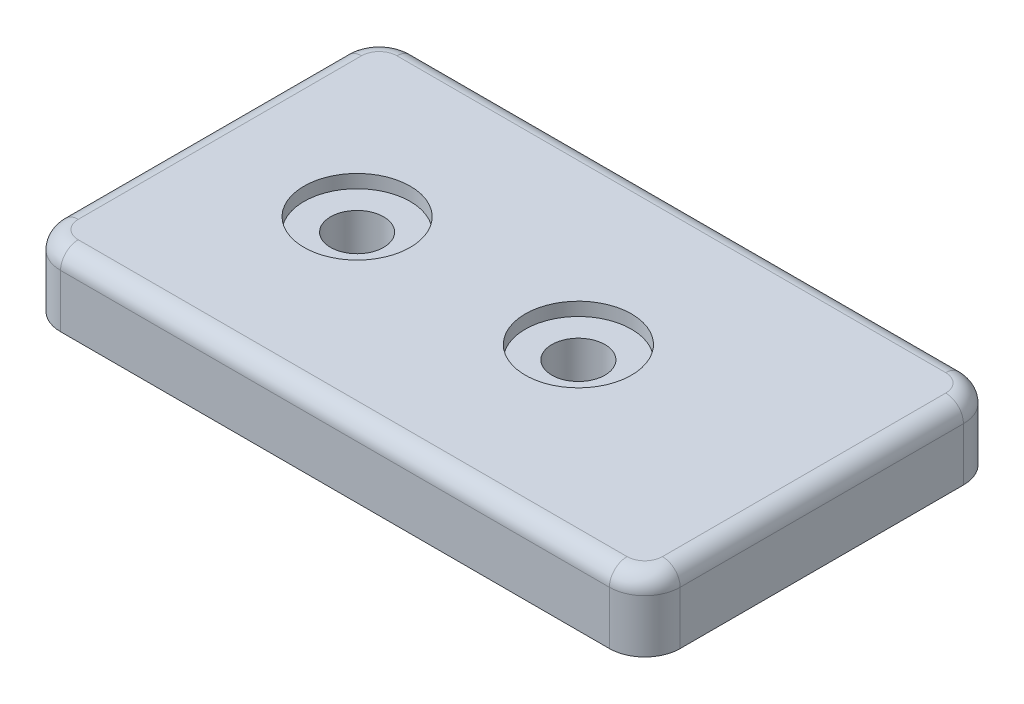
ISO-10303-21;
HEADER;
FILE_DESCRIPTION(('STEP AP214'),'2;1');
FILE_NAME('part.step','',(''),(''),'','','');
FILE_SCHEMA(('AUTOMOTIVE_DESIGN { 1 0 10303 214 1 1 1 1 }'));
ENDSEC;
DATA;
#1=APPLICATION_CONTEXT('core data for automotive mechanical design processes');
#2=APPLICATION_PROTOCOL_DEFINITION('international standard','automotive_design',2000,#1);
#3=PRODUCT_CONTEXT('',#1,'mechanical');
#4=PRODUCT('Part','Part','',(#3));
#5=PRODUCT_RELATED_PRODUCT_CATEGORY('part','',(#4));
#6=PRODUCT_DEFINITION_FORMATION('','',#4);
#7=PRODUCT_DEFINITION_CONTEXT('part definition',#1,'design');
#8=PRODUCT_DEFINITION('design','',#6,#7);
#9=PRODUCT_DEFINITION_SHAPE('','',#8);
#10=(LENGTH_UNIT() NAMED_UNIT(*) SI_UNIT(.MILLI.,.METRE.));
#11=(NAMED_UNIT(*) PLANE_ANGLE_UNIT() SI_UNIT($,.RADIAN.));
#12=(NAMED_UNIT(*) SI_UNIT($,.STERADIAN.) SOLID_ANGLE_UNIT());
#13=UNCERTAINTY_MEASURE_WITH_UNIT(LENGTH_MEASURE(1.E-05),#10,'distance_accuracy_value','');
#14=(GEOMETRIC_REPRESENTATION_CONTEXT(3) GLOBAL_UNCERTAINTY_ASSIGNED_CONTEXT((#13)) GLOBAL_UNIT_ASSIGNED_CONTEXT((#10,
#11,#12)) REPRESENTATION_CONTEXT('',''));
#15=CARTESIAN_POINT('',(0.,0.,0.));
#16=DIRECTION('',(0.,0.,1.));
#17=DIRECTION('',(1.,0.,0.));
#18=AXIS2_PLACEMENT_3D('',#15,#16,#17);
#19=CARTESIAN_POINT('',(12.5,8.,0.));
#20=DIRECTION('',(0.,-1.,0.));
#21=DIRECTION('',(0.,0.,1.));
#22=AXIS2_PLACEMENT_3D('',#19,#20,#21);
#23=CYLINDRICAL_SURFACE('',#22,3.);
#24=CARTESIAN_POINT('',(12.5,0.,0.));
#25=DIRECTION('',(0.,-1.,0.));
#26=DIRECTION('',(0.,0.,-1.));
#27=AXIS2_PLACEMENT_3D('',#24,#25,#26);
#28=CIRCLE('',#27,3.);
#29=CARTESIAN_POINT('',(12.5,0.,-2.99999999999999));
#30=VERTEX_POINT('',#29);
#31=EDGE_CURVE('E295',#30,#30,#28,.T.);
#32=ORIENTED_EDGE('',*,*,#31,.T.);
#33=EDGE_LOOP('',(#32));
#34=FACE_BOUND('',#33,.T.);
#35=CARTESIAN_POINT('',(12.5,6.5,0.));
#36=DIRECTION('',(0.,-1.,0.));
#37=DIRECTION('',(0.,0.,-1.));
#38=AXIS2_PLACEMENT_3D('',#35,#36,#37);
#39=CIRCLE('',#38,3.);
#40=CARTESIAN_POINT('',(12.5,6.5,-2.99999999999999));
#41=VERTEX_POINT('',#40);
#42=EDGE_CURVE('E280',#41,#41,#39,.T.);
#43=ORIENTED_EDGE('',*,*,#42,.F.);
#44=EDGE_LOOP('',(#43));
#45=FACE_BOUND('',#44,.T.);
#46=ADVANCED_FACE('F43',(#34,#45),#23,.F.);
#47=CARTESIAN_POINT('',(-12.5,8.,0.));
#48=DIRECTION('',(0.,-1.,0.));
#49=DIRECTION('',(0.,0.,1.));
#50=AXIS2_PLACEMENT_3D('',#47,#48,#49);
#51=CYLINDRICAL_SURFACE('',#50,3.);
#52=CARTESIAN_POINT('',(-12.5,0.,0.));
#53=DIRECTION('',(0.,-1.,0.));
#54=DIRECTION('',(0.,0.,-1.));
#55=AXIS2_PLACEMENT_3D('',#52,#53,#54);
#56=CIRCLE('',#55,3.);
#57=CARTESIAN_POINT('',(-12.5,0.,-3.));
#58=VERTEX_POINT('',#57);
#59=EDGE_CURVE('E298',#58,#58,#56,.T.);
#60=ORIENTED_EDGE('',*,*,#59,.T.);
#61=EDGE_LOOP('',(#60));
#62=FACE_BOUND('',#61,.T.);
#63=CARTESIAN_POINT('',(-12.5,6.5,0.));
#64=DIRECTION('',(0.,-1.,0.));
#65=DIRECTION('',(0.,0.,-1.));
#66=AXIS2_PLACEMENT_3D('',#63,#64,#65);
#67=CIRCLE('',#66,3.);
#68=CARTESIAN_POINT('',(-12.5,6.5,-3.));
#69=VERTEX_POINT('',#68);
#70=EDGE_CURVE('E265',#69,#69,#67,.T.);
#71=ORIENTED_EDGE('',*,*,#70,.F.);
#72=EDGE_LOOP('',(#71));
#73=FACE_BOUND('',#72,.T.);
#74=ADVANCED_FACE('F499',(#62,#73),#51,.F.);
#75=CARTESIAN_POINT('',(36.,8.,16.));
#76=DIRECTION('',(0.,-1.,0.));
#77=DIRECTION('',(0.,0.,1.));
#78=AXIS2_PLACEMENT_3D('',#75,#76,#77);
#79=CYLINDRICAL_SURFACE('',#78,4.);
#80=DIRECTION('',(0.,-1.,0.));
#81=VECTOR('',#80,1.);
#82=CARTESIAN_POINT('',(36.,8.,20.));
#83=LINE('',#82,#81);
#84=CARTESIAN_POINT('',(36.,6.,20.));
#85=VERTEX_POINT('',#84);
#86=CARTESIAN_POINT('',(36.,0.,20.));
#87=VERTEX_POINT('',#86);
#88=EDGE_CURVE('E322',#85,#87,#83,.T.);
#89=ORIENTED_EDGE('',*,*,#88,.T.);
#90=CARTESIAN_POINT('',(36.,0.,16.));
#91=DIRECTION('',(0.,-1.,0.));
#92=DIRECTION('',(0.,0.,-1.));
#93=AXIS2_PLACEMENT_3D('',#90,#91,#92);
#94=CIRCLE('',#93,4.);
#95=CARTESIAN_POINT('',(40.,0.,16.));
#96=VERTEX_POINT('',#95);
#97=EDGE_CURVE('E276',#87,#96,#94,.F.);
#98=ORIENTED_EDGE('',*,*,#97,.T.);
#99=DIRECTION('',(0.,-1.,0.));
#100=VECTOR('',#99,1.);
#101=CARTESIAN_POINT('',(40.,8.,16.));
#102=LINE('',#101,#100);
#103=CARTESIAN_POINT('',(40.,6.,16.));
#104=VERTEX_POINT('',#103);
#105=EDGE_CURVE('E301',#104,#96,#102,.T.);
#106=ORIENTED_EDGE('',*,*,#105,.F.);
#107=CARTESIAN_POINT('',(36.,6.,16.));
#108=DIRECTION('',(0.,-1.,0.));
#109=DIRECTION('',(0.,0.,-1.));
#110=AXIS2_PLACEMENT_3D('',#107,#108,#109);
#111=CIRCLE('',#110,4.);
#112=EDGE_CURVE('E371',#85,#104,#111,.F.);
#113=ORIENTED_EDGE('',*,*,#112,.F.);
#114=EDGE_LOOP('',(#89,#98,#106,#113));
#115=FACE_BOUND('',#114,.T.);
#116=ADVANCED_FACE('F505',(#115),#79,.T.);
#117=CARTESIAN_POINT('',(0.,8.,20.));
#118=DIRECTION('',(0.,0.,1.));
#119=DIRECTION('',(-1.,0.,0.));
#120=AXIS2_PLACEMENT_3D('',#117,#118,#119);
#121=PLANE('',#120);
#122=DIRECTION('',(0.,-1.,0.));
#123=VECTOR('',#122,1.);
#124=CARTESIAN_POINT('',(-26.,8.,20.));
#125=LINE('',#124,#123);
#126=CARTESIAN_POINT('',(-26.,6.,20.));
#127=VERTEX_POINT('',#126);
#128=CARTESIAN_POINT('',(-26.,0.,20.));
#129=VERTEX_POINT('',#128);
#130=EDGE_CURVE('E319',#127,#129,#125,.T.);
#131=ORIENTED_EDGE('',*,*,#130,.T.);
#132=DIRECTION('',(1.,0.,0.));
#133=VECTOR('',#132,1.);
#134=CARTESIAN_POINT('',(0.,0.,20.));
#135=LINE('',#134,#133);
#136=EDGE_CURVE('E279',#129,#87,#135,.T.);
#137=ORIENTED_EDGE('',*,*,#136,.T.);
#138=ORIENTED_EDGE('',*,*,#88,.F.);
#139=DIRECTION('',(1.,0.,0.));
#140=VECTOR('',#139,1.);
#141=CARTESIAN_POINT('',(0.,6.,20.));
#142=LINE('',#141,#140);
#143=EDGE_CURVE('E374',#127,#85,#142,.T.);
#144=ORIENTED_EDGE('',*,*,#143,.F.);
#145=EDGE_LOOP('',(#131,#137,#138,#144));
#146=FACE_BOUND('',#145,.T.);
#147=ADVANCED_FACE('F535',(#146),#121,.T.);
#148=CARTESIAN_POINT('',(-26.,8.,16.));
#149=DIRECTION('',(0.,-1.,0.));
#150=DIRECTION('',(0.,0.,1.));
#151=AXIS2_PLACEMENT_3D('',#148,#149,#150);
#152=CYLINDRICAL_SURFACE('',#151,4.);
#153=DIRECTION('',(0.,-1.,0.));
#154=VECTOR('',#153,1.);
#155=CARTESIAN_POINT('',(-30.,8.,16.));
#156=LINE('',#155,#154);
#157=CARTESIAN_POINT('',(-30.,6.,16.));
#158=VERTEX_POINT('',#157);
#159=CARTESIAN_POINT('',(-30.,0.,16.));
#160=VERTEX_POINT('',#159);
#161=EDGE_CURVE('E316',#158,#160,#156,.T.);
#162=ORIENTED_EDGE('',*,*,#161,.T.);
#163=CARTESIAN_POINT('',(-26.,0.,16.));
#164=DIRECTION('',(0.,-1.,0.));
#165=DIRECTION('',(0.,0.,-1.));
#166=AXIS2_PLACEMENT_3D('',#163,#164,#165);
#167=CIRCLE('',#166,4.);
#168=EDGE_CURVE('E282',#160,#129,#167,.F.);
#169=ORIENTED_EDGE('',*,*,#168,.T.);
#170=ORIENTED_EDGE('',*,*,#130,.F.);
#171=CARTESIAN_POINT('',(-26.,6.,16.));
#172=DIRECTION('',(0.,-1.,0.));
#173=DIRECTION('',(0.,0.,-1.));
#174=AXIS2_PLACEMENT_3D('',#171,#172,#173);
#175=CIRCLE('',#174,4.);
#176=EDGE_CURVE('E325',#158,#127,#175,.F.);
#177=ORIENTED_EDGE('',*,*,#176,.F.);
#178=EDGE_LOOP('',(#162,#169,#170,#177));
#179=FACE_BOUND('',#178,.T.);
#180=ADVANCED_FACE('F531',(#179),#152,.T.);
#181=CARTESIAN_POINT('',(-30.,8.,0.));
#182=DIRECTION('',(-1.,0.,0.));
#183=DIRECTION('',(0.,0.,-1.));
#184=AXIS2_PLACEMENT_3D('',#181,#182,#183);
#185=PLANE('',#184);
#186=DIRECTION('',(0.,-1.,0.));
#187=VECTOR('',#186,1.);
#188=CARTESIAN_POINT('',(-30.,8.,-16.));
#189=LINE('',#188,#187);
#190=CARTESIAN_POINT('',(-30.,6.,-16.));
#191=VERTEX_POINT('',#190);
#192=CARTESIAN_POINT('',(-30.,0.,-16.));
#193=VERTEX_POINT('',#192);
#194=EDGE_CURVE('E313',#191,#193,#189,.T.);
#195=ORIENTED_EDGE('',*,*,#194,.T.);
#196=DIRECTION('',(0.,0.,1.));
#197=VECTOR('',#196,1.);
#198=CARTESIAN_POINT('',(-30.,0.,0.));
#199=LINE('',#198,#197);
#200=EDGE_CURVE('E284',#193,#160,#199,.T.);
#201=ORIENTED_EDGE('',*,*,#200,.T.);
#202=ORIENTED_EDGE('',*,*,#161,.F.);
#203=DIRECTION('',(0.,0.,1.));
#204=VECTOR('',#203,1.);
#205=CARTESIAN_POINT('',(-30.,6.,0.));
#206=LINE('',#205,#204);
#207=EDGE_CURVE('E356',#191,#158,#206,.T.);
#208=ORIENTED_EDGE('',*,*,#207,.F.);
#209=EDGE_LOOP('',(#195,#201,#202,#208));
#210=FACE_BOUND('',#209,.T.);
#211=ADVANCED_FACE('F527',(#210),#185,.T.);
#212=CARTESIAN_POINT('',(-26.,8.,-16.));
#213=DIRECTION('',(0.,-1.,0.));
#214=DIRECTION('',(0.,0.,1.));
#215=AXIS2_PLACEMENT_3D('',#212,#213,#214);
#216=CYLINDRICAL_SURFACE('',#215,4.);
#217=DIRECTION('',(0.,-1.,0.));
#218=VECTOR('',#217,1.);
#219=CARTESIAN_POINT('',(-26.,8.,-20.));
#220=LINE('',#219,#218);
#221=CARTESIAN_POINT('',(-26.,6.,-20.));
#222=VERTEX_POINT('',#221);
#223=CARTESIAN_POINT('',(-26.,0.,-20.));
#224=VERTEX_POINT('',#223);
#225=EDGE_CURVE('E310',#222,#224,#220,.T.);
#226=ORIENTED_EDGE('',*,*,#225,.T.);
#227=CARTESIAN_POINT('',(-26.,0.,-16.));
#228=DIRECTION('',(0.,-1.,0.));
#229=DIRECTION('',(0.,0.,-1.));
#230=AXIS2_PLACEMENT_3D('',#227,#228,#229);
#231=CIRCLE('',#230,4.);
#232=EDGE_CURVE('E286',#224,#193,#231,.F.);
#233=ORIENTED_EDGE('',*,*,#232,.T.);
#234=ORIENTED_EDGE('',*,*,#194,.F.);
#235=CARTESIAN_POINT('',(-26.,6.,-16.));
#236=DIRECTION('',(0.,-1.,0.));
#237=DIRECTION('',(0.,0.,-1.));
#238=AXIS2_PLACEMENT_3D('',#235,#236,#237);
#239=CIRCLE('',#238,4.);
#240=EDGE_CURVE('E359',#222,#191,#239,.F.);
#241=ORIENTED_EDGE('',*,*,#240,.F.);
#242=EDGE_LOOP('',(#226,#233,#234,#241));
#243=FACE_BOUND('',#242,.T.);
#244=ADVANCED_FACE('F523',(#243),#216,.T.);
#245=CARTESIAN_POINT('',(0.,8.,-20.));
#246=DIRECTION('',(0.,0.,1.));
#247=DIRECTION('',(-1.,0.,0.));
#248=AXIS2_PLACEMENT_3D('',#245,#246,#247);
#249=PLANE('',#248);
#250=DIRECTION('',(0.,-1.,0.));
#251=VECTOR('',#250,1.);
#252=CARTESIAN_POINT('',(36.,8.,-20.));
#253=LINE('',#252,#251);
#254=CARTESIAN_POINT('',(36.,6.,-20.));
#255=VERTEX_POINT('',#254);
#256=CARTESIAN_POINT('',(36.,0.,-20.));
#257=VERTEX_POINT('',#256);
#258=EDGE_CURVE('E307',#255,#257,#253,.T.);
#259=ORIENTED_EDGE('',*,*,#258,.T.);
#260=DIRECTION('',(1.,0.,0.));
#261=VECTOR('',#260,1.);
#262=CARTESIAN_POINT('',(0.,0.,-20.));
#263=LINE('',#262,#261);
#264=EDGE_CURVE('E288',#224,#257,#263,.T.);
#265=ORIENTED_EDGE('',*,*,#264,.F.);
#266=ORIENTED_EDGE('',*,*,#225,.F.);
#267=DIRECTION('',(1.,0.,0.));
#268=VECTOR('',#267,1.);
#269=CARTESIAN_POINT('',(-26.,6.,-20.));
#270=LINE('',#269,#268);
#271=EDGE_CURVE('E362',#255,#222,#270,.F.);
#272=ORIENTED_EDGE('',*,*,#271,.F.);
#273=EDGE_LOOP('',(#259,#265,#266,#272));
#274=FACE_BOUND('',#273,.T.);
#275=ADVANCED_FACE('F519',(#274),#249,.F.);
#276=CARTESIAN_POINT('',(36.,8.,-16.));
#277=DIRECTION('',(0.,-1.,0.));
#278=DIRECTION('',(0.,0.,1.));
#279=AXIS2_PLACEMENT_3D('',#276,#277,#278);
#280=CYLINDRICAL_SURFACE('',#279,4.);
#281=DIRECTION('',(0.,-1.,0.));
#282=VECTOR('',#281,1.);
#283=CARTESIAN_POINT('',(40.,8.,-16.));
#284=LINE('',#283,#282);
#285=CARTESIAN_POINT('',(40.,6.,-16.));
#286=VERTEX_POINT('',#285);
#287=CARTESIAN_POINT('',(40.,0.,-16.));
#288=VERTEX_POINT('',#287);
#289=EDGE_CURVE('E304',#286,#288,#284,.T.);
#290=ORIENTED_EDGE('',*,*,#289,.T.);
#291=CARTESIAN_POINT('',(36.,0.,-16.));
#292=DIRECTION('',(0.,-1.,0.));
#293=DIRECTION('',(0.,0.,-1.));
#294=AXIS2_PLACEMENT_3D('',#291,#292,#293);
#295=CIRCLE('',#294,4.);
#296=EDGE_CURVE('E291',#288,#257,#295,.F.);
#297=ORIENTED_EDGE('',*,*,#296,.T.);
#298=ORIENTED_EDGE('',*,*,#258,.F.);
#299=CARTESIAN_POINT('',(36.,6.,-16.));
#300=DIRECTION('',(0.,-1.,0.));
#301=DIRECTION('',(0.,0.,-1.));
#302=AXIS2_PLACEMENT_3D('',#299,#300,#301);
#303=CIRCLE('',#302,4.);
#304=EDGE_CURVE('E365',#286,#255,#303,.F.);
#305=ORIENTED_EDGE('',*,*,#304,.F.);
#306=EDGE_LOOP('',(#290,#297,#298,#305));
#307=FACE_BOUND('',#306,.T.);
#308=ADVANCED_FACE('F515',(#307),#280,.T.);
#309=CARTESIAN_POINT('',(40.,8.,0.));
#310=DIRECTION('',(1.,0.,0.));
#311=DIRECTION('',(0.,0.,1.));
#312=AXIS2_PLACEMENT_3D('',#309,#310,#311);
#313=PLANE('',#312);
#314=ORIENTED_EDGE('',*,*,#105,.T.);
#315=DIRECTION('',(0.,0.,-1.));
#316=VECTOR('',#315,1.);
#317=CARTESIAN_POINT('',(40.,0.,0.));
#318=LINE('',#317,#316);
#319=EDGE_CURVE('E293',#96,#288,#318,.T.);
#320=ORIENTED_EDGE('',*,*,#319,.T.);
#321=ORIENTED_EDGE('',*,*,#289,.F.);
#322=DIRECTION('',(0.,0.,-1.));
#323=VECTOR('',#322,1.);
#324=CARTESIAN_POINT('',(40.,6.,0.));
#325=LINE('',#324,#323);
#326=EDGE_CURVE('E368',#104,#286,#325,.T.);
#327=ORIENTED_EDGE('',*,*,#326,.F.);
#328=EDGE_LOOP('',(#314,#320,#321,#327));
#329=FACE_BOUND('',#328,.T.);
#330=ADVANCED_FACE('F511',(#329),#313,.T.);
#331=CARTESIAN_POINT('',(0.,8.,0.));
#332=DIRECTION('',(0.,1.,0.));
#333=DIRECTION('',(0.,0.,-1.));
#334=AXIS2_PLACEMENT_3D('',#331,#332,#333);
#335=PLANE('',#334);
#336=DIRECTION('',(1.,0.,0.));
#337=VECTOR('',#336,1.);
#338=CARTESIAN_POINT('',(0.,8.,18.));
#339=LINE('',#338,#337);
#340=CARTESIAN_POINT('',(36.,8.,18.));
#341=VERTEX_POINT('',#340);
#342=CARTESIAN_POINT('',(-26.,8.,18.));
#343=VERTEX_POINT('',#342);
#344=EDGE_CURVE('E332',#341,#343,#339,.F.);
#345=ORIENTED_EDGE('',*,*,#344,.F.);
#346=CARTESIAN_POINT('',(36.,8.,16.));
#347=DIRECTION('',(0.,-1.,0.));
#348=DIRECTION('',(0.,0.,-1.));
#349=AXIS2_PLACEMENT_3D('',#346,#347,#348);
#350=CIRCLE('',#349,2.);
#351=CARTESIAN_POINT('',(38.,8.,16.));
#352=VERTEX_POINT('',#351);
#353=EDGE_CURVE('E335',#352,#341,#350,.T.);
#354=ORIENTED_EDGE('',*,*,#353,.F.);
#355=DIRECTION('',(0.,0.,-1.));
#356=VECTOR('',#355,1.);
#357=CARTESIAN_POINT('',(38.,8.,0.));
#358=LINE('',#357,#356);
#359=CARTESIAN_POINT('',(38.,8.,-16.));
#360=VERTEX_POINT('',#359);
#361=EDGE_CURVE('E338',#360,#352,#358,.F.);
#362=ORIENTED_EDGE('',*,*,#361,.F.);
#363=CARTESIAN_POINT('',(36.,8.,-16.));
#364=DIRECTION('',(0.,-1.,0.));
#365=DIRECTION('',(0.,0.,-1.));
#366=AXIS2_PLACEMENT_3D('',#363,#364,#365);
#367=CIRCLE('',#366,2.);
#368=CARTESIAN_POINT('',(36.,8.,-18.));
#369=VERTEX_POINT('',#368);
#370=EDGE_CURVE('E341',#369,#360,#367,.T.);
#371=ORIENTED_EDGE('',*,*,#370,.F.);
#372=DIRECTION('',(1.,0.,0.));
#373=VECTOR('',#372,1.);
#374=CARTESIAN_POINT('',(36.,8.,-18.));
#375=LINE('',#374,#373);
#376=CARTESIAN_POINT('',(-26.,8.,-18.));
#377=VERTEX_POINT('',#376);
#378=EDGE_CURVE('E344',#377,#369,#375,.T.);
#379=ORIENTED_EDGE('',*,*,#378,.F.);
#380=CARTESIAN_POINT('',(-26.,8.,-16.));
#381=DIRECTION('',(0.,-1.,0.));
#382=DIRECTION('',(0.,0.,-1.));
#383=AXIS2_PLACEMENT_3D('',#380,#381,#382);
#384=CIRCLE('',#383,2.);
#385=CARTESIAN_POINT('',(-28.,8.,-16.));
#386=VERTEX_POINT('',#385);
#387=EDGE_CURVE('E347',#386,#377,#384,.T.);
#388=ORIENTED_EDGE('',*,*,#387,.F.);
#389=DIRECTION('',(0.,0.,1.));
#390=VECTOR('',#389,1.);
#391=CARTESIAN_POINT('',(-28.,8.,0.));
#392=LINE('',#391,#390);
#393=CARTESIAN_POINT('',(-28.,8.,16.));
#394=VERTEX_POINT('',#393);
#395=EDGE_CURVE('E350',#394,#386,#392,.F.);
#396=ORIENTED_EDGE('',*,*,#395,.F.);
#397=CARTESIAN_POINT('',(-26.,8.,16.));
#398=DIRECTION('',(0.,-1.,0.));
#399=DIRECTION('',(0.,0.,-1.));
#400=AXIS2_PLACEMENT_3D('',#397,#398,#399);
#401=CIRCLE('',#400,2.);
#402=EDGE_CURVE('E353',#343,#394,#401,.T.);
#403=ORIENTED_EDGE('',*,*,#402,.F.);
#404=EDGE_LOOP('',(#345,#354,#362,#371,#379,#388,#396,#403));
#405=FACE_BOUND('',#404,.T.);
#406=CARTESIAN_POINT('',(-12.5,8.,0.));
#407=DIRECTION('',(0.,-1.,0.));
#408=DIRECTION('',(0.,0.,-1.));
#409=AXIS2_PLACEMENT_3D('',#406,#407,#408);
#410=CIRCLE('',#409,6.);
#411=CARTESIAN_POINT('',(-12.5,8.,-6.));
#412=VERTEX_POINT('',#411);
#413=EDGE_CURVE('E266',#412,#412,#410,.T.);
#414=ORIENTED_EDGE('',*,*,#413,.T.);
#415=EDGE_LOOP('',(#414));
#416=FACE_BOUND('',#415,.T.);
#417=CARTESIAN_POINT('',(12.5,8.,0.));
#418=DIRECTION('',(0.,-1.,0.));
#419=DIRECTION('',(0.,0.,-1.));
#420=AXIS2_PLACEMENT_3D('',#417,#418,#419);
#421=CIRCLE('',#420,6.);
#422=CARTESIAN_POINT('',(12.5,8.,-6.));
#423=VERTEX_POINT('',#422);
#424=EDGE_CURVE('E269',#423,#423,#421,.T.);
#425=ORIENTED_EDGE('',*,*,#424,.T.);
#426=EDGE_LOOP('',(#425));
#427=FACE_BOUND('',#426,.T.);
#428=ADVANCED_FACE('F514',(#405,#416,#427),#335,.T.);
#429=CARTESIAN_POINT('',(0.,0.,0.));
#430=DIRECTION('',(0.,1.,0.));
#431=DIRECTION('',(0.,0.,-1.));
#432=AXIS2_PLACEMENT_3D('',#429,#430,#431);
#433=PLANE('',#432);
#434=DIRECTION('',(0.,0.,-1.));
#435=VECTOR('',#434,1.);
#436=CARTESIAN_POINT('',(-8.,0.,0.));
#437=LINE('',#436,#435);
#438=CARTESIAN_POINT('',(-8.,0.,10.5));
#439=VERTEX_POINT('',#438);
#440=CARTESIAN_POINT('',(-8.,0.,-10.5));
#441=VERTEX_POINT('',#440);
#442=EDGE_CURVE('E410',#439,#441,#437,.T.);
#443=ORIENTED_EDGE('',*,*,#442,.F.);
#444=CARTESIAN_POINT('',(-5.5,0.,10.5));
#445=DIRECTION('',(0.,-1.,0.));
#446=DIRECTION('',(0.,0.,-1.));
#447=AXIS2_PLACEMENT_3D('',#444,#445,#446);
#448=CIRCLE('',#447,2.5);
#449=CARTESIAN_POINT('',(-5.5,0.,13.));
#450=VERTEX_POINT('',#449);
#451=EDGE_CURVE('E407',#450,#439,#448,.T.);
#452=ORIENTED_EDGE('',*,*,#451,.F.);
#453=DIRECTION('',(-1.,0.,0.));
#454=VECTOR('',#453,1.);
#455=CARTESIAN_POINT('',(0.,0.,13.));
#456=LINE('',#455,#454);
#457=CARTESIAN_POINT('',(5.5,0.,13.));
#458=VERTEX_POINT('',#457);
#459=EDGE_CURVE('E404',#458,#450,#456,.T.);
#460=ORIENTED_EDGE('',*,*,#459,.F.);
#461=CARTESIAN_POINT('',(5.5,0.,10.5));
#462=DIRECTION('',(0.,-1.,0.));
#463=DIRECTION('',(0.,0.,-1.));
#464=AXIS2_PLACEMENT_3D('',#461,#462,#463);
#465=CIRCLE('',#464,2.5);
#466=CARTESIAN_POINT('',(8.,0.,10.5));
#467=VERTEX_POINT('',#466);
#468=EDGE_CURVE('E401',#467,#458,#465,.T.);
#469=ORIENTED_EDGE('',*,*,#468,.F.);
#470=DIRECTION('',(0.,0.,1.));
#471=VECTOR('',#470,1.);
#472=CARTESIAN_POINT('',(8.,0.,0.));
#473=LINE('',#472,#471);
#474=CARTESIAN_POINT('',(8.,0.,-10.5));
#475=VERTEX_POINT('',#474);
#476=EDGE_CURVE('E398',#475,#467,#473,.T.);
#477=ORIENTED_EDGE('',*,*,#476,.F.);
#478=CARTESIAN_POINT('',(5.5,0.,-10.5));
#479=DIRECTION('',(0.,-1.,0.));
#480=DIRECTION('',(0.,0.,-1.));
#481=AXIS2_PLACEMENT_3D('',#478,#479,#480);
#482=CIRCLE('',#481,2.5);
#483=CARTESIAN_POINT('',(5.5,0.,-13.));
#484=VERTEX_POINT('',#483);
#485=EDGE_CURVE('E396',#484,#475,#482,.T.);
#486=ORIENTED_EDGE('',*,*,#485,.F.);
#487=DIRECTION('',(1.,0.,0.));
#488=VECTOR('',#487,1.);
#489=CARTESIAN_POINT('',(0.,0.,-13.));
#490=LINE('',#489,#488);
#491=CARTESIAN_POINT('',(-5.5,0.,-13.));
#492=VERTEX_POINT('',#491);
#493=EDGE_CURVE('E394',#492,#484,#490,.T.);
#494=ORIENTED_EDGE('',*,*,#493,.F.);
#495=CARTESIAN_POINT('',(-5.5,0.,-10.5));
#496=DIRECTION('',(0.,-1.,0.));
#497=DIRECTION('',(0.,0.,-1.));
#498=AXIS2_PLACEMENT_3D('',#495,#496,#497);
#499=CIRCLE('',#498,2.5);
#500=EDGE_CURVE('E413',#441,#492,#499,.T.);
#501=ORIENTED_EDGE('',*,*,#500,.F.);
#502=EDGE_LOOP('',(#443,#452,#460,#469,#477,#486,#494,#501));
#503=FACE_BOUND('',#502,.T.);
#504=ORIENTED_EDGE('',*,*,#97,.F.);
#505=ORIENTED_EDGE('',*,*,#136,.F.);
#506=ORIENTED_EDGE('',*,*,#168,.F.);
#507=ORIENTED_EDGE('',*,*,#200,.F.);
#508=ORIENTED_EDGE('',*,*,#232,.F.);
#509=ORIENTED_EDGE('',*,*,#264,.T.);
#510=ORIENTED_EDGE('',*,*,#296,.F.);
#511=ORIENTED_EDGE('',*,*,#319,.F.);
#512=EDGE_LOOP('',(#504,#505,#506,#507,#508,#509,#510,#511));
#513=FACE_BOUND('',#512,.T.);
#514=ORIENTED_EDGE('',*,*,#31,.F.);
#515=EDGE_LOOP('',(#514));
#516=FACE_BOUND('',#515,.T.);
#517=ORIENTED_EDGE('',*,*,#59,.F.);
#518=EDGE_LOOP('',(#517));
#519=FACE_BOUND('',#518,.T.);
#520=ADVANCED_FACE('F470',(#503,#513,#516,#519),#433,.F.);
#521=CARTESIAN_POINT('',(12.5,6.5,0.));
#522=DIRECTION('',(0.,1.,0.));
#523=DIRECTION('',(0.,0.,-1.));
#524=AXIS2_PLACEMENT_3D('',#521,#522,#523);
#525=CYLINDRICAL_SURFACE('',#524,6.);
#526=CARTESIAN_POINT('',(12.5,6.5,0.));
#527=DIRECTION('',(0.,-1.,0.));
#528=DIRECTION('',(0.,0.,-1.));
#529=AXIS2_PLACEMENT_3D('',#526,#527,#528);
#530=CIRCLE('',#529,6.);
#531=CARTESIAN_POINT('',(12.5,6.5,-6.));
#532=VERTEX_POINT('',#531);
#533=EDGE_CURVE('E272',#532,#532,#530,.T.);
#534=ORIENTED_EDGE('',*,*,#533,.T.);
#535=EDGE_LOOP('',(#534));
#536=FACE_BOUND('',#535,.T.);
#537=ORIENTED_EDGE('',*,*,#424,.F.);
#538=EDGE_LOOP('',(#537));
#539=FACE_BOUND('',#538,.T.);
#540=ADVANCED_FACE('F618',(#536,#539),#525,.F.);
#541=CARTESIAN_POINT('',(12.5,6.5,0.));
#542=DIRECTION('',(0.,1.,0.));
#543=DIRECTION('',(0.,0.,-1.));
#544=AXIS2_PLACEMENT_3D('',#541,#542,#543);
#545=PLANE('',#544);
#546=ORIENTED_EDGE('',*,*,#42,.T.);
#547=EDGE_LOOP('',(#546));
#548=FACE_BOUND('',#547,.T.);
#549=ORIENTED_EDGE('',*,*,#533,.F.);
#550=EDGE_LOOP('',(#549));
#551=FACE_BOUND('',#550,.T.);
#552=ADVANCED_FACE('F620',(#548,#551),#545,.T.);
#553=CARTESIAN_POINT('',(-12.5,6.5,0.));
#554=DIRECTION('',(0.,1.,0.));
#555=DIRECTION('',(0.,0.,-1.));
#556=AXIS2_PLACEMENT_3D('',#553,#554,#555);
#557=CYLINDRICAL_SURFACE('',#556,6.);
#558=CARTESIAN_POINT('',(-12.5,6.5,0.));
#559=DIRECTION('',(0.,-1.,0.));
#560=DIRECTION('',(0.,0.,-1.));
#561=AXIS2_PLACEMENT_3D('',#558,#559,#560);
#562=CIRCLE('',#561,6.);
#563=CARTESIAN_POINT('',(-12.5,6.5,-6.));
#564=VERTEX_POINT('',#563);
#565=EDGE_CURVE('E262',#564,#564,#562,.T.);
#566=ORIENTED_EDGE('',*,*,#565,.T.);
#567=EDGE_LOOP('',(#566));
#568=FACE_BOUND('',#567,.T.);
#569=ORIENTED_EDGE('',*,*,#413,.F.);
#570=EDGE_LOOP('',(#569));
#571=FACE_BOUND('',#570,.T.);
#572=ADVANCED_FACE('F578',(#568,#571),#557,.F.);
#573=CARTESIAN_POINT('',(-12.5,6.5,0.));
#574=DIRECTION('',(0.,1.,0.));
#575=DIRECTION('',(0.,0.,-1.));
#576=AXIS2_PLACEMENT_3D('',#573,#574,#575);
#577=PLANE('',#576);
#578=ORIENTED_EDGE('',*,*,#70,.T.);
#579=EDGE_LOOP('',(#578));
#580=FACE_BOUND('',#579,.T.);
#581=ORIENTED_EDGE('',*,*,#565,.F.);
#582=EDGE_LOOP('',(#581));
#583=FACE_BOUND('',#582,.T.);
#584=ADVANCED_FACE('F573',(#580,#583),#577,.T.);
#585=CARTESIAN_POINT('',(36.,6.,-16.));
#586=DIRECTION('',(0.,1.,0.));
#587=DIRECTION('',(0.,0.,-1.));
#588=AXIS2_PLACEMENT_3D('',#585,#586,#587);
#589=DEGENERATE_TOROIDAL_SURFACE('',#588,2.,2.,.T.);
#590=CARTESIAN_POINT('',(38.,6.,-16.));
#591=DIRECTION('',(0.,0.,-1.));
#592=DIRECTION('',(-1.,0.,0.));
#593=AXIS2_PLACEMENT_3D('',#590,#591,#592);
#594=CIRCLE('',#593,2.);
#595=EDGE_CURVE('E389',#360,#286,#594,.T.);
#596=ORIENTED_EDGE('',*,*,#595,.T.);
#597=ORIENTED_EDGE('',*,*,#304,.T.);
#598=CARTESIAN_POINT('',(36.,6.,-18.));
#599=DIRECTION('',(1.,0.,0.));
#600=DIRECTION('',(0.,0.,-1.));
#601=AXIS2_PLACEMENT_3D('',#598,#599,#600);
#602=CIRCLE('',#601,2.);
#603=EDGE_CURVE('E275',#255,#369,#602,.T.);
#604=ORIENTED_EDGE('',*,*,#603,.T.);
#605=ORIENTED_EDGE('',*,*,#370,.T.);
#606=EDGE_LOOP('',(#596,#597,#604,#605));
#607=FACE_BOUND('',#606,.T.);
#608=ADVANCED_FACE('F570',(#607),#589,.T.);
#609=CARTESIAN_POINT('',(0.,6.,-18.));
#610=DIRECTION('',(-1.,0.,0.));
#611=DIRECTION('',(0.,0.,-1.));
#612=AXIS2_PLACEMENT_3D('',#609,#610,#611);
#613=CYLINDRICAL_SURFACE('',#612,2.);
#614=ORIENTED_EDGE('',*,*,#603,.F.);
#615=ORIENTED_EDGE('',*,*,#271,.T.);
#616=CARTESIAN_POINT('',(-26.,6.,-18.));
#617=DIRECTION('',(1.,0.,0.));
#618=DIRECTION('',(0.,0.,-1.));
#619=AXIS2_PLACEMENT_3D('',#616,#617,#618);
#620=CIRCLE('',#619,2.);
#621=EDGE_CURVE('E387',#222,#377,#620,.T.);
#622=ORIENTED_EDGE('',*,*,#621,.T.);
#623=ORIENTED_EDGE('',*,*,#378,.T.);
#624=EDGE_LOOP('',(#614,#615,#622,#623));
#625=FACE_BOUND('',#624,.T.);
#626=ADVANCED_FACE('F566',(#625),#613,.T.);
#627=CARTESIAN_POINT('',(38.,6.,0.));
#628=DIRECTION('',(0.,0.,-1.));
#629=DIRECTION('',(1.,0.,0.));
#630=AXIS2_PLACEMENT_3D('',#627,#628,#629);
#631=CYLINDRICAL_SURFACE('',#630,2.);
#632=ORIENTED_EDGE('',*,*,#595,.F.);
#633=ORIENTED_EDGE('',*,*,#361,.T.);
#634=CARTESIAN_POINT('',(38.,6.,16.));
#635=DIRECTION('',(0.,0.,-1.));
#636=DIRECTION('',(-1.,0.,0.));
#637=AXIS2_PLACEMENT_3D('',#634,#635,#636);
#638=CIRCLE('',#637,2.);
#639=EDGE_CURVE('E385',#352,#104,#638,.T.);
#640=ORIENTED_EDGE('',*,*,#639,.T.);
#641=ORIENTED_EDGE('',*,*,#326,.T.);
#642=EDGE_LOOP('',(#632,#633,#640,#641));
#643=FACE_BOUND('',#642,.T.);
#644=ADVANCED_FACE('F562',(#643),#631,.T.);
#645=CARTESIAN_POINT('',(-26.,6.,-16.));
#646=DIRECTION('',(0.,1.,0.));
#647=DIRECTION('',(0.,0.,-1.));
#648=AXIS2_PLACEMENT_3D('',#645,#646,#647);
#649=DEGENERATE_TOROIDAL_SURFACE('',#648,2.,2.,.T.);
#650=ORIENTED_EDGE('',*,*,#621,.F.);
#651=ORIENTED_EDGE('',*,*,#240,.T.);
#652=CARTESIAN_POINT('',(-28.,6.,-16.));
#653=DIRECTION('',(0.,0.,-1.));
#654=DIRECTION('',(-1.,0.,0.));
#655=AXIS2_PLACEMENT_3D('',#652,#653,#654);
#656=CIRCLE('',#655,2.);
#657=EDGE_CURVE('E383',#191,#386,#656,.T.);
#658=ORIENTED_EDGE('',*,*,#657,.T.);
#659=ORIENTED_EDGE('',*,*,#387,.T.);
#660=EDGE_LOOP('',(#650,#651,#658,#659));
#661=FACE_BOUND('',#660,.T.);
#662=ADVANCED_FACE('F558',(#661),#649,.T.);
#663=CARTESIAN_POINT('',(36.,6.,16.));
#664=DIRECTION('',(0.,1.,0.));
#665=DIRECTION('',(0.,0.,-1.));
#666=AXIS2_PLACEMENT_3D('',#663,#664,#665);
#667=DEGENERATE_TOROIDAL_SURFACE('',#666,2.,2.,.T.);
#668=ORIENTED_EDGE('',*,*,#639,.F.);
#669=ORIENTED_EDGE('',*,*,#353,.T.);
#670=CARTESIAN_POINT('',(36.,6.,18.));
#671=DIRECTION('',(1.,0.,0.));
#672=DIRECTION('',(0.,0.,-1.));
#673=AXIS2_PLACEMENT_3D('',#670,#671,#672);
#674=CIRCLE('',#673,2.);
#675=EDGE_CURVE('E381',#341,#85,#674,.T.);
#676=ORIENTED_EDGE('',*,*,#675,.T.);
#677=ORIENTED_EDGE('',*,*,#112,.T.);
#678=EDGE_LOOP('',(#668,#669,#676,#677));
#679=FACE_BOUND('',#678,.T.);
#680=ADVANCED_FACE('F554',(#679),#667,.T.);
#681=CARTESIAN_POINT('',(-28.,6.,0.));
#682=DIRECTION('',(0.,0.,1.));
#683=DIRECTION('',(-1.,0.,0.));
#684=AXIS2_PLACEMENT_3D('',#681,#682,#683);
#685=CYLINDRICAL_SURFACE('',#684,2.);
#686=ORIENTED_EDGE('',*,*,#657,.F.);
#687=ORIENTED_EDGE('',*,*,#207,.T.);
#688=CARTESIAN_POINT('',(-28.,6.,16.));
#689=DIRECTION('',(0.,0.,-1.));
#690=DIRECTION('',(-1.,0.,0.));
#691=AXIS2_PLACEMENT_3D('',#688,#689,#690);
#692=CIRCLE('',#691,2.);
#693=EDGE_CURVE('E379',#158,#394,#692,.T.);
#694=ORIENTED_EDGE('',*,*,#693,.T.);
#695=ORIENTED_EDGE('',*,*,#395,.T.);
#696=EDGE_LOOP('',(#686,#687,#694,#695));
#697=FACE_BOUND('',#696,.T.);
#698=ADVANCED_FACE('F550',(#697),#685,.T.);
#699=CARTESIAN_POINT('',(0.,6.,18.));
#700=DIRECTION('',(1.,0.,0.));
#701=DIRECTION('',(0.,0.,1.));
#702=AXIS2_PLACEMENT_3D('',#699,#700,#701);
#703=CYLINDRICAL_SURFACE('',#702,2.);
#704=ORIENTED_EDGE('',*,*,#675,.F.);
#705=ORIENTED_EDGE('',*,*,#344,.T.);
#706=CARTESIAN_POINT('',(-26.,6.,18.));
#707=DIRECTION('',(1.,0.,0.));
#708=DIRECTION('',(0.,0.,-1.));
#709=AXIS2_PLACEMENT_3D('',#706,#707,#708);
#710=CIRCLE('',#709,2.);
#711=EDGE_CURVE('E245',#343,#127,#710,.T.);
#712=ORIENTED_EDGE('',*,*,#711,.T.);
#713=ORIENTED_EDGE('',*,*,#143,.T.);
#714=EDGE_LOOP('',(#704,#705,#712,#713));
#715=FACE_BOUND('',#714,.T.);
#716=ADVANCED_FACE('F546',(#715),#703,.T.);
#717=CARTESIAN_POINT('',(-26.,6.,16.));
#718=DIRECTION('',(0.,1.,0.));
#719=DIRECTION('',(0.,0.,-1.));
#720=AXIS2_PLACEMENT_3D('',#717,#718,#719);
#721=TOROIDAL_SURFACE('',#720,2.,2.);
#722=ORIENTED_EDGE('',*,*,#693,.F.);
#723=ORIENTED_EDGE('',*,*,#176,.T.);
#724=ORIENTED_EDGE('',*,*,#711,.F.);
#725=ORIENTED_EDGE('',*,*,#402,.T.);
#726=EDGE_LOOP('',(#722,#723,#724,#725));
#727=FACE_BOUND('',#726,.T.);
#728=ADVANCED_FACE('F543',(#727),#721,.T.);
#729=CARTESIAN_POINT('',(5.5,3.,-10.5));
#730=DIRECTION('',(0.,-1.,0.));
#731=DIRECTION('',(0.,0.,1.));
#732=AXIS2_PLACEMENT_3D('',#729,#730,#731);
#733=CYLINDRICAL_SURFACE('',#732,2.);
#734=DIRECTION('',(0.,-1.,0.));
#735=VECTOR('',#734,1.);
#736=CARTESIAN_POINT('',(7.5,3.,-10.5));
#737=LINE('',#736,#735);
#738=CARTESIAN_POINT('',(7.5,3.,-10.5));
#739=VERTEX_POINT('',#738);
#740=CARTESIAN_POINT('',(7.5,0.5,-10.5));
#741=VERTEX_POINT('',#740);
#742=EDGE_CURVE('E230',#739,#741,#737,.T.);
#743=ORIENTED_EDGE('',*,*,#742,.F.);
#744=CARTESIAN_POINT('',(5.5,3.,-10.5));
#745=DIRECTION('',(0.,1.,0.));
#746=DIRECTION('',(0.,0.,-1.));
#747=AXIS2_PLACEMENT_3D('',#744,#745,#746);
#748=CIRCLE('',#747,2.);
#749=CARTESIAN_POINT('',(5.5,3.,-12.5));
#750=VERTEX_POINT('',#749);
#751=EDGE_CURVE('E212',#739,#750,#748,.T.);
#752=ORIENTED_EDGE('',*,*,#751,.T.);
#753=DIRECTION('',(0.,-1.,0.));
#754=VECTOR('',#753,1.);
#755=CARTESIAN_POINT('',(5.5,3.,-12.5));
#756=LINE('',#755,#754);
#757=CARTESIAN_POINT('',(5.5,0.5,-12.5));
#758=VERTEX_POINT('',#757);
#759=EDGE_CURVE('E221',#750,#758,#756,.T.);
#760=ORIENTED_EDGE('',*,*,#759,.T.);
#761=CARTESIAN_POINT('',(5.5,0.5,-10.5));
#762=DIRECTION('',(0.,-1.,0.));
#763=DIRECTION('',(0.,0.,-1.));
#764=AXIS2_PLACEMENT_3D('',#761,#762,#763);
#765=CIRCLE('',#764,2.);
#766=EDGE_CURVE('E52',#741,#758,#765,.F.);
#767=ORIENTED_EDGE('',*,*,#766,.F.);
#768=EDGE_LOOP('',(#743,#752,#760,#767));
#769=FACE_BOUND('',#768,.T.);
#770=ADVANCED_FACE('F228',(#769),#733,.F.);
#771=CARTESIAN_POINT('',(7.5,3.,10.5));
#772=DIRECTION('',(1.,0.,0.));
#773=DIRECTION('',(0.,0.,1.));
#774=AXIS2_PLACEMENT_3D('',#771,#772,#773);
#775=PLANE('',#774);
#776=DIRECTION('',(0.,-1.,0.));
#777=VECTOR('',#776,1.);
#778=CARTESIAN_POINT('',(7.5,3.,10.5));
#779=LINE('',#778,#777);
#780=CARTESIAN_POINT('',(7.5,3.,10.5));
#781=VERTEX_POINT('',#780);
#782=CARTESIAN_POINT('',(7.5,0.5,10.5));
#783=VERTEX_POINT('',#782);
#784=EDGE_CURVE('E246',#781,#783,#779,.T.);
#785=ORIENTED_EDGE('',*,*,#784,.F.);
#786=DIRECTION('',(0.,0.,-1.));
#787=VECTOR('',#786,1.);
#788=CARTESIAN_POINT('',(7.5,3.,10.5));
#789=LINE('',#788,#787);
#790=EDGE_CURVE('E226',#781,#739,#789,.T.);
#791=ORIENTED_EDGE('',*,*,#790,.T.);
#792=ORIENTED_EDGE('',*,*,#742,.T.);
#793=DIRECTION('',(0.,0.,-1.));
#794=VECTOR('',#793,1.);
#795=CARTESIAN_POINT('',(7.5,0.5,10.5));
#796=LINE('',#795,#794);
#797=EDGE_CURVE('E428',#783,#741,#796,.T.);
#798=ORIENTED_EDGE('',*,*,#797,.F.);
#799=EDGE_LOOP('',(#785,#791,#792,#798));
#800=FACE_BOUND('',#799,.T.);
#801=ADVANCED_FACE('F459',(#800),#775,.F.);
#802=CARTESIAN_POINT('',(5.5,3.,10.5));
#803=DIRECTION('',(0.,-1.,0.));
#804=DIRECTION('',(0.,0.,1.));
#805=AXIS2_PLACEMENT_3D('',#802,#803,#804);
#806=CYLINDRICAL_SURFACE('',#805,2.);
#807=DIRECTION('',(0.,-1.,0.));
#808=VECTOR('',#807,1.);
#809=CARTESIAN_POINT('',(5.5,3.,12.5));
#810=LINE('',#809,#808);
#811=CARTESIAN_POINT('',(5.5,3.,12.5));
#812=VERTEX_POINT('',#811);
#813=CARTESIAN_POINT('',(5.5,0.5,12.5));
#814=VERTEX_POINT('',#813);
#815=EDGE_CURVE('E249',#812,#814,#810,.T.);
#816=ORIENTED_EDGE('',*,*,#815,.F.);
#817=CARTESIAN_POINT('',(5.5,3.,10.5));
#818=DIRECTION('',(0.,1.,0.));
#819=DIRECTION('',(0.,0.,1.));
#820=AXIS2_PLACEMENT_3D('',#817,#818,#819);
#821=CIRCLE('',#820,2.);
#822=EDGE_CURVE('E241',#812,#781,#821,.T.);
#823=ORIENTED_EDGE('',*,*,#822,.T.);
#824=ORIENTED_EDGE('',*,*,#784,.T.);
#825=CARTESIAN_POINT('',(5.5,0.5,10.5));
#826=DIRECTION('',(0.,-1.,0.));
#827=DIRECTION('',(0.,0.,-1.));
#828=AXIS2_PLACEMENT_3D('',#825,#826,#827);
#829=CIRCLE('',#828,2.);
#830=EDGE_CURVE('E425',#814,#783,#829,.F.);
#831=ORIENTED_EDGE('',*,*,#830,.F.);
#832=EDGE_LOOP('',(#816,#823,#824,#831));
#833=FACE_BOUND('',#832,.T.);
#834=ADVANCED_FACE('F452',(#833),#806,.F.);
#835=CARTESIAN_POINT('',(-5.5,3.,12.5));
#836=DIRECTION('',(0.,0.,1.));
#837=DIRECTION('',(-1.,0.,0.));
#838=AXIS2_PLACEMENT_3D('',#835,#836,#837);
#839=PLANE('',#838);
#840=DIRECTION('',(0.,-1.,0.));
#841=VECTOR('',#840,1.);
#842=CARTESIAN_POINT('',(-5.5,3.,12.5));
#843=LINE('',#842,#841);
#844=CARTESIAN_POINT('',(-5.5,3.,12.5));
#845=VERTEX_POINT('',#844);
#846=CARTESIAN_POINT('',(-5.5,0.5,12.5));
#847=VERTEX_POINT('',#846);
#848=EDGE_CURVE('E252',#845,#847,#843,.T.);
#849=ORIENTED_EDGE('',*,*,#848,.F.);
#850=DIRECTION('',(1.,0.,0.));
#851=VECTOR('',#850,1.);
#852=CARTESIAN_POINT('',(-5.5,3.,12.5));
#853=LINE('',#852,#851);
#854=EDGE_CURVE('E239',#845,#812,#853,.T.);
#855=ORIENTED_EDGE('',*,*,#854,.T.);
#856=ORIENTED_EDGE('',*,*,#815,.T.);
#857=DIRECTION('',(1.,0.,0.));
#858=VECTOR('',#857,1.);
#859=CARTESIAN_POINT('',(-5.5,0.5,12.5));
#860=LINE('',#859,#858);
#861=EDGE_CURVE('E422',#847,#814,#860,.T.);
#862=ORIENTED_EDGE('',*,*,#861,.F.);
#863=EDGE_LOOP('',(#849,#855,#856,#862));
#864=FACE_BOUND('',#863,.T.);
#865=ADVANCED_FACE('F454',(#864),#839,.F.);
#866=CARTESIAN_POINT('',(-5.5,3.,10.5));
#867=DIRECTION('',(0.,-1.,0.));
#868=DIRECTION('',(0.,0.,1.));
#869=AXIS2_PLACEMENT_3D('',#866,#867,#868);
#870=CYLINDRICAL_SURFACE('',#869,2.);
#871=DIRECTION('',(0.,-1.,0.));
#872=VECTOR('',#871,1.);
#873=CARTESIAN_POINT('',(-7.5,3.,10.5));
#874=LINE('',#873,#872);
#875=CARTESIAN_POINT('',(-7.5,3.,10.5));
#876=VERTEX_POINT('',#875);
#877=CARTESIAN_POINT('',(-7.5,0.5,10.5));
#878=VERTEX_POINT('',#877);
#879=EDGE_CURVE('E255',#876,#878,#874,.T.);
#880=ORIENTED_EDGE('',*,*,#879,.F.);
#881=CARTESIAN_POINT('',(-5.5,3.,10.5));
#882=DIRECTION('',(0.,1.,0.));
#883=DIRECTION('',(0.,0.,-1.));
#884=AXIS2_PLACEMENT_3D('',#881,#882,#883);
#885=CIRCLE('',#884,2.);
#886=EDGE_CURVE('E237',#876,#845,#885,.T.);
#887=ORIENTED_EDGE('',*,*,#886,.T.);
#888=ORIENTED_EDGE('',*,*,#848,.T.);
#889=CARTESIAN_POINT('',(-5.5,0.5,10.5));
#890=DIRECTION('',(0.,-1.,0.));
#891=DIRECTION('',(0.,0.,-1.));
#892=AXIS2_PLACEMENT_3D('',#889,#890,#891);
#893=CIRCLE('',#892,2.);
#894=EDGE_CURVE('E419',#878,#847,#893,.F.);
#895=ORIENTED_EDGE('',*,*,#894,.F.);
#896=EDGE_LOOP('',(#880,#887,#888,#895));
#897=FACE_BOUND('',#896,.T.);
#898=ADVANCED_FACE('F478',(#897),#870,.F.);
#899=CARTESIAN_POINT('',(-7.5,3.,10.5));
#900=DIRECTION('',(-1.,0.,0.));
#901=DIRECTION('',(0.,0.,-1.));
#902=AXIS2_PLACEMENT_3D('',#899,#900,#901);
#903=PLANE('',#902);
#904=DIRECTION('',(0.,-1.,0.));
#905=VECTOR('',#904,1.);
#906=CARTESIAN_POINT('',(-7.5,3.,-10.5));
#907=LINE('',#906,#905);
#908=CARTESIAN_POINT('',(-7.5,3.,-10.5));
#909=VERTEX_POINT('',#908);
#910=CARTESIAN_POINT('',(-7.5,0.5,-10.5));
#911=VERTEX_POINT('',#910);
#912=EDGE_CURVE('E258',#909,#911,#907,.T.);
#913=ORIENTED_EDGE('',*,*,#912,.F.);
#914=DIRECTION('',(0.,0.,1.));
#915=VECTOR('',#914,1.);
#916=CARTESIAN_POINT('',(-7.5,3.,10.5));
#917=LINE('',#916,#915);
#918=EDGE_CURVE('E235',#909,#876,#917,.T.);
#919=ORIENTED_EDGE('',*,*,#918,.T.);
#920=ORIENTED_EDGE('',*,*,#879,.T.);
#921=DIRECTION('',(0.,0.,1.));
#922=VECTOR('',#921,1.);
#923=CARTESIAN_POINT('',(-7.5,0.5,10.5));
#924=LINE('',#923,#922);
#925=EDGE_CURVE('E416',#911,#878,#924,.T.);
#926=ORIENTED_EDGE('',*,*,#925,.F.);
#927=EDGE_LOOP('',(#913,#919,#920,#926));
#928=FACE_BOUND('',#927,.T.);
#929=ADVANCED_FACE('F482',(#928),#903,.F.);
#930=CARTESIAN_POINT('',(-5.5,3.,-10.5));
#931=DIRECTION('',(0.,-1.,0.));
#932=DIRECTION('',(0.,0.,1.));
#933=AXIS2_PLACEMENT_3D('',#930,#931,#932);
#934=CYLINDRICAL_SURFACE('',#933,2.);
#935=DIRECTION('',(0.,-1.,0.));
#936=VECTOR('',#935,1.);
#937=CARTESIAN_POINT('',(-5.5,3.,-12.5));
#938=LINE('',#937,#936);
#939=CARTESIAN_POINT('',(-5.5,3.,-12.5));
#940=VERTEX_POINT('',#939);
#941=CARTESIAN_POINT('',(-5.5,0.5,-12.5));
#942=VERTEX_POINT('',#941);
#943=EDGE_CURVE('E225',#940,#942,#938,.T.);
#944=ORIENTED_EDGE('',*,*,#943,.F.);
#945=CARTESIAN_POINT('',(-5.5,3.,-10.5));
#946=DIRECTION('',(0.,1.,0.));
#947=DIRECTION('',(0.,0.,-1.));
#948=AXIS2_PLACEMENT_3D('',#945,#946,#947);
#949=CIRCLE('',#948,2.);
#950=EDGE_CURVE('E215',#940,#909,#949,.T.);
#951=ORIENTED_EDGE('',*,*,#950,.T.);
#952=ORIENTED_EDGE('',*,*,#912,.T.);
#953=CARTESIAN_POINT('',(-5.5,0.5,-10.5));
#954=DIRECTION('',(0.,-1.,0.));
#955=DIRECTION('',(0.,0.,-1.));
#956=AXIS2_PLACEMENT_3D('',#953,#954,#955);
#957=CIRCLE('',#956,2.);
#958=EDGE_CURVE('E377',#942,#911,#957,.F.);
#959=ORIENTED_EDGE('',*,*,#958,.F.);
#960=EDGE_LOOP('',(#944,#951,#952,#959));
#961=FACE_BOUND('',#960,.T.);
#962=ADVANCED_FACE('F485',(#961),#934,.F.);
#963=CARTESIAN_POINT('',(-5.5,3.,-12.5));
#964=DIRECTION('',(0.,0.,-1.));
#965=DIRECTION('',(1.,0.,0.));
#966=AXIS2_PLACEMENT_3D('',#963,#964,#965);
#967=PLANE('',#966);
#968=ORIENTED_EDGE('',*,*,#759,.F.);
#969=DIRECTION('',(-1.,0.,0.));
#970=VECTOR('',#969,1.);
#971=CARTESIAN_POINT('',(-5.5,3.,-12.5));
#972=LINE('',#971,#970);
#973=EDGE_CURVE('E207',#750,#940,#972,.T.);
#974=ORIENTED_EDGE('',*,*,#973,.T.);
#975=ORIENTED_EDGE('',*,*,#943,.T.);
#976=DIRECTION('',(-1.,0.,0.));
#977=VECTOR('',#976,1.);
#978=CARTESIAN_POINT('',(-5.5,0.5,-12.5));
#979=LINE('',#978,#977);
#980=EDGE_CURVE('E11',#758,#942,#979,.T.);
#981=ORIENTED_EDGE('',*,*,#980,.F.);
#982=EDGE_LOOP('',(#968,#974,#975,#981));
#983=FACE_BOUND('',#982,.T.);
#984=ADVANCED_FACE('F222',(#983),#967,.F.);
#985=CARTESIAN_POINT('',(5.5,3.,-10.5));
#986=DIRECTION('',(0.,1.,0.));
#987=DIRECTION('',(0.,0.,-1.));
#988=AXIS2_PLACEMENT_3D('',#985,#986,#987);
#989=PLANE('',#988);
#990=ORIENTED_EDGE('',*,*,#751,.F.);
#991=ORIENTED_EDGE('',*,*,#790,.F.);
#992=ORIENTED_EDGE('',*,*,#822,.F.);
#993=ORIENTED_EDGE('',*,*,#854,.F.);
#994=ORIENTED_EDGE('',*,*,#886,.F.);
#995=ORIENTED_EDGE('',*,*,#918,.F.);
#996=ORIENTED_EDGE('',*,*,#950,.F.);
#997=ORIENTED_EDGE('',*,*,#973,.F.);
#998=EDGE_LOOP('',(#990,#991,#992,#993,#994,#995,#996,#997));
#999=FACE_BOUND('',#998,.T.);
#1000=ADVANCED_FACE('F209',(#999),#989,.F.);
#1001=CARTESIAN_POINT('',(5.5,0.5,10.5));
#1002=DIRECTION('',(0.,-1.,0.));
#1003=DIRECTION('',(0.,0.,1.));
#1004=AXIS2_PLACEMENT_3D('',#1001,#1002,#1003);
#1005=CONICAL_SURFACE('',#1004,2.,0.785398163397448);
#1006=DIRECTION('',(0.,0.707106781186547,-0.707106781186547));
#1007=VECTOR('',#1006,1.);
#1008=CARTESIAN_POINT('',(5.5,0.,13.));
#1009=LINE('',#1008,#1007);
#1010=EDGE_CURVE('E232',#458,#814,#1009,.T.);
#1011=ORIENTED_EDGE('',*,*,#1010,.T.);
#1012=ORIENTED_EDGE('',*,*,#830,.T.);
#1013=DIRECTION('',(0.707106781186547,-0.707106781186547,0.));
#1014=VECTOR('',#1013,1.);
#1015=CARTESIAN_POINT('',(7.5,0.5,10.5));
#1016=LINE('',#1015,#1014);
#1017=EDGE_CURVE('E47',#783,#467,#1016,.T.);
#1018=ORIENTED_EDGE('',*,*,#1017,.T.);
#1019=ORIENTED_EDGE('',*,*,#468,.T.);
#1020=EDGE_LOOP('',(#1011,#1012,#1018,#1019));
#1021=FACE_BOUND('',#1020,.T.);
#1022=ADVANCED_FACE('F45',(#1021),#1005,.F.);
#1023=CARTESIAN_POINT('',(7.5,0.5,10.5));
#1024=DIRECTION('',(0.707106781186548,0.707106781186547,0.));
#1025=DIRECTION('',(0.,0.,-1.));
#1026=AXIS2_PLACEMENT_3D('',#1023,#1024,#1025);
#1027=PLANE('',#1026);
#1028=ORIENTED_EDGE('',*,*,#1017,.F.);
#1029=ORIENTED_EDGE('',*,*,#797,.T.);
#1030=DIRECTION('',(0.707106781186547,-0.707106781186548,0.));
#1031=VECTOR('',#1030,1.);
#1032=CARTESIAN_POINT('',(7.5,0.5,-10.5));
#1033=LINE('',#1032,#1031);
#1034=EDGE_CURVE('E67',#741,#475,#1033,.T.);
#1035=ORIENTED_EDGE('',*,*,#1034,.T.);
#1036=ORIENTED_EDGE('',*,*,#476,.T.);
#1037=EDGE_LOOP('',(#1028,#1029,#1035,#1036));
#1038=FACE_BOUND('',#1037,.T.);
#1039=ADVANCED_FACE('F461',(#1038),#1027,.F.);
#1040=CARTESIAN_POINT('',(-5.5,0.5,12.5));
#1041=DIRECTION('',(0.,0.707106781186547,0.707106781186547));
#1042=DIRECTION('',(1.,0.,0.));
#1043=AXIS2_PLACEMENT_3D('',#1040,#1041,#1042);
#1044=PLANE('',#1043);
#1045=ORIENTED_EDGE('',*,*,#1010,.F.);
#1046=ORIENTED_EDGE('',*,*,#459,.T.);
#1047=DIRECTION('',(0.,0.707106781186547,-0.707106781186547));
#1048=VECTOR('',#1047,1.);
#1049=CARTESIAN_POINT('',(-5.5,0.,13.));
#1050=LINE('',#1049,#1048);
#1051=EDGE_CURVE('E438',#450,#847,#1050,.T.);
#1052=ORIENTED_EDGE('',*,*,#1051,.T.);
#1053=ORIENTED_EDGE('',*,*,#861,.T.);
#1054=EDGE_LOOP('',(#1045,#1046,#1052,#1053));
#1055=FACE_BOUND('',#1054,.T.);
#1056=ADVANCED_FACE('F447',(#1055),#1044,.F.);
#1057=CARTESIAN_POINT('',(5.5,0.5,-10.5));
#1058=DIRECTION('',(0.,-1.,0.));
#1059=DIRECTION('',(0.,0.,1.));
#1060=AXIS2_PLACEMENT_3D('',#1057,#1058,#1059);
#1061=CONICAL_SURFACE('',#1060,2.,0.785398163397448);
#1062=ORIENTED_EDGE('',*,*,#1034,.F.);
#1063=ORIENTED_EDGE('',*,*,#766,.T.);
#1064=DIRECTION('',(0.,-0.707106781186547,-0.707106781186547));
#1065=VECTOR('',#1064,1.);
#1066=CARTESIAN_POINT('',(5.5,0.5,-12.5));
#1067=LINE('',#1066,#1065);
#1068=EDGE_CURVE('E59',#758,#484,#1067,.T.);
#1069=ORIENTED_EDGE('',*,*,#1068,.T.);
#1070=ORIENTED_EDGE('',*,*,#485,.T.);
#1071=EDGE_LOOP('',(#1062,#1063,#1069,#1070));
#1072=FACE_BOUND('',#1071,.T.);
#1073=ADVANCED_FACE('F462',(#1072),#1061,.F.);
#1074=CARTESIAN_POINT('',(-5.5,0.5,10.5));
#1075=DIRECTION('',(0.,-1.,0.));
#1076=DIRECTION('',(0.,0.,1.));
#1077=AXIS2_PLACEMENT_3D('',#1074,#1075,#1076);
#1078=CONICAL_SURFACE('',#1077,2.,0.785398163397449);
#1079=ORIENTED_EDGE('',*,*,#1051,.F.);
#1080=ORIENTED_EDGE('',*,*,#451,.T.);
#1081=DIRECTION('',(0.707106781186547,0.707106781186547,0.));
#1082=VECTOR('',#1081,1.);
#1083=CARTESIAN_POINT('',(-8.,0.,10.5));
#1084=LINE('',#1083,#1082);
#1085=EDGE_CURVE('E435',#439,#878,#1084,.T.);
#1086=ORIENTED_EDGE('',*,*,#1085,.T.);
#1087=ORIENTED_EDGE('',*,*,#894,.T.);
#1088=EDGE_LOOP('',(#1079,#1080,#1086,#1087));
#1089=FACE_BOUND('',#1088,.T.);
#1090=ADVANCED_FACE('F474',(#1089),#1078,.F.);
#1091=CARTESIAN_POINT('',(-5.5,0.5,-12.5));
#1092=DIRECTION('',(0.,0.707106781186547,-0.707106781186547));
#1093=DIRECTION('',(-1.,0.,0.));
#1094=AXIS2_PLACEMENT_3D('',#1091,#1092,#1093);
#1095=PLANE('',#1094);
#1096=ORIENTED_EDGE('',*,*,#1068,.F.);
#1097=ORIENTED_EDGE('',*,*,#980,.T.);
#1098=DIRECTION('',(0.,-0.707106781186547,-0.707106781186547));
#1099=VECTOR('',#1098,1.);
#1100=CARTESIAN_POINT('',(-5.5,0.5,-12.5));
#1101=LINE('',#1100,#1099);
#1102=EDGE_CURVE('E433',#942,#492,#1101,.T.);
#1103=ORIENTED_EDGE('',*,*,#1102,.T.);
#1104=ORIENTED_EDGE('',*,*,#493,.T.);
#1105=EDGE_LOOP('',(#1096,#1097,#1103,#1104));
#1106=FACE_BOUND('',#1105,.T.);
#1107=ADVANCED_FACE('F466',(#1106),#1095,.F.);
#1108=CARTESIAN_POINT('',(-7.5,0.5,10.5));
#1109=DIRECTION('',(-0.707106781186547,0.707106781186548,0.));
#1110=DIRECTION('',(0.,0.,1.));
#1111=AXIS2_PLACEMENT_3D('',#1108,#1109,#1110);
#1112=PLANE('',#1111);
#1113=ORIENTED_EDGE('',*,*,#1085,.F.);
#1114=ORIENTED_EDGE('',*,*,#442,.T.);
#1115=DIRECTION('',(0.707106781186548,0.707106781186547,0.));
#1116=VECTOR('',#1115,1.);
#1117=CARTESIAN_POINT('',(-8.,0.,-10.5));
#1118=LINE('',#1117,#1116);
#1119=EDGE_CURVE('E431',#441,#911,#1118,.T.);
#1120=ORIENTED_EDGE('',*,*,#1119,.T.);
#1121=ORIENTED_EDGE('',*,*,#925,.T.);
#1122=EDGE_LOOP('',(#1113,#1114,#1120,#1121));
#1123=FACE_BOUND('',#1122,.T.);
#1124=ADVANCED_FACE('F489',(#1123),#1112,.F.);
#1125=CARTESIAN_POINT('',(-5.5,0.5,-10.5));
#1126=DIRECTION('',(0.,-1.,0.));
#1127=DIRECTION('',(0.,0.,1.));
#1128=AXIS2_PLACEMENT_3D('',#1125,#1126,#1127);
#1129=CONICAL_SURFACE('',#1128,2.,0.785398163397449);
#1130=ORIENTED_EDGE('',*,*,#1102,.F.);
#1131=ORIENTED_EDGE('',*,*,#958,.T.);
#1132=ORIENTED_EDGE('',*,*,#1119,.F.);
#1133=ORIENTED_EDGE('',*,*,#500,.T.);
#1134=EDGE_LOOP('',(#1130,#1131,#1132,#1133));
#1135=FACE_BOUND('',#1134,.T.);
#1136=ADVANCED_FACE('F487',(#1135),#1129,.F.);
#1137=CLOSED_SHELL('',(#46,#74,#116,#147,#180,#211,#244,#275,#308,#330,#428,#520,#540,#552,#572,
#584,#608,#626,#644,#662,#680,#698,#716,#728,#770,#801,#834,#865,#898,#929,#962,#984,#1000,
#1022,#1039,#1056,#1073,#1090,#1107,#1124,#1136));
#1138=MANIFOLD_SOLID_BREP('B2',#1137);
#1139=ADVANCED_BREP_SHAPE_REPRESENTATION('',(#18,#1138),#14);
#1140=SHAPE_DEFINITION_REPRESENTATION(#9,#1139);
ENDSEC;
END-ISO-10303-21;
